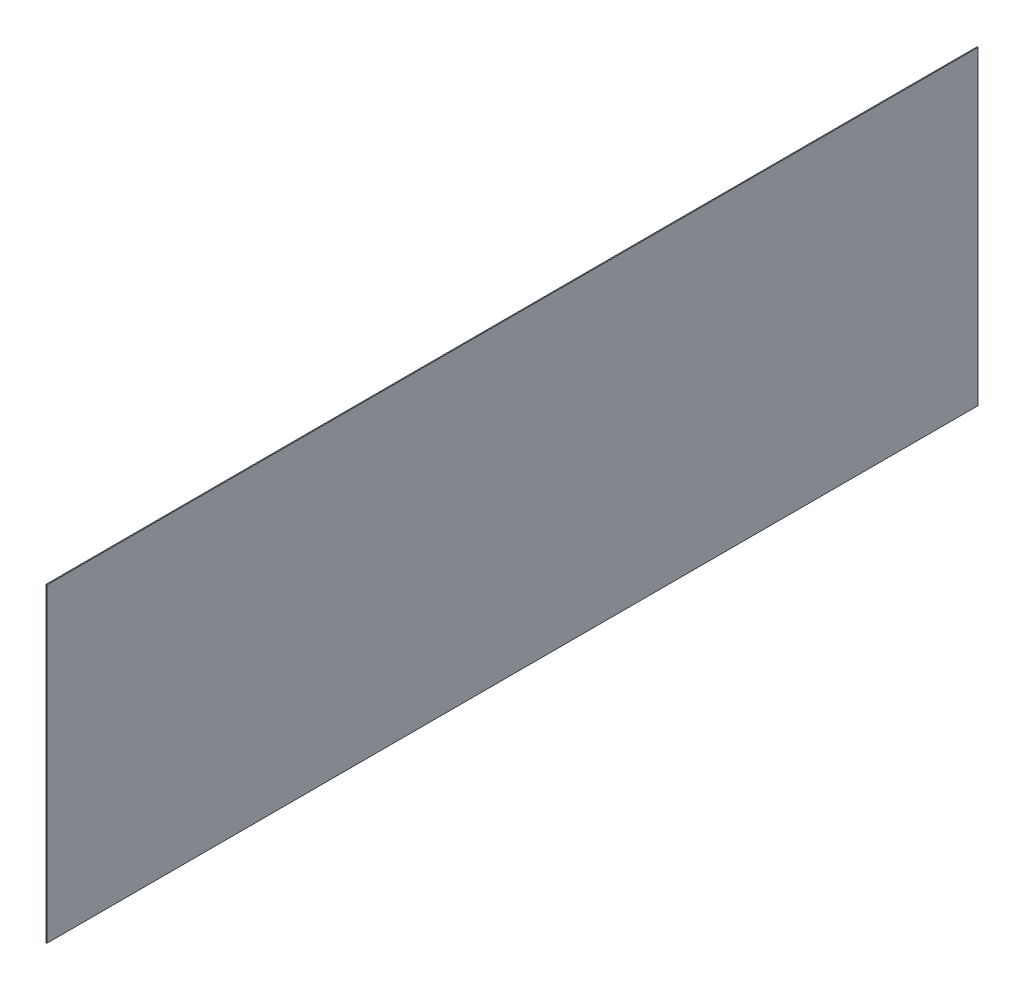
ISO-10303-21;
HEADER;
FILE_DESCRIPTION(('STEP AP214'),'2;1');
FILE_NAME('part.step','',(''),(''),'','','');
FILE_SCHEMA(('AUTOMOTIVE_DESIGN { 1 0 10303 214 1 1 1 1 }'));
ENDSEC;
DATA;
#1=APPLICATION_CONTEXT('core data for automotive mechanical design processes');
#2=APPLICATION_PROTOCOL_DEFINITION('international standard','automotive_design',2000,#1);
#3=PRODUCT_CONTEXT('',#1,'mechanical');
#4=PRODUCT('Part','Part','',(#3));
#5=PRODUCT_RELATED_PRODUCT_CATEGORY('part','',(#4));
#6=PRODUCT_DEFINITION_FORMATION('','',#4);
#7=PRODUCT_DEFINITION_CONTEXT('part definition',#1,'design');
#8=PRODUCT_DEFINITION('design','',#6,#7);
#9=PRODUCT_DEFINITION_SHAPE('','',#8);
#10=(LENGTH_UNIT() NAMED_UNIT(*) SI_UNIT(.MILLI.,.METRE.));
#11=(NAMED_UNIT(*) PLANE_ANGLE_UNIT() SI_UNIT($,.RADIAN.));
#12=(NAMED_UNIT(*) SI_UNIT($,.STERADIAN.) SOLID_ANGLE_UNIT());
#13=UNCERTAINTY_MEASURE_WITH_UNIT(LENGTH_MEASURE(1.E-05),#10,'distance_accuracy_value','');
#14=(GEOMETRIC_REPRESENTATION_CONTEXT(3) GLOBAL_UNCERTAINTY_ASSIGNED_CONTEXT((#13)) GLOBAL_UNIT_ASSIGNED_CONTEXT((#10,
#11,#12)) REPRESENTATION_CONTEXT('',''));
#15=CARTESIAN_POINT('',(0.,0.,0.));
#16=DIRECTION('',(0.,0.,1.));
#17=DIRECTION('',(1.,0.,0.));
#18=AXIS2_PLACEMENT_3D('',#15,#16,#17);
#19=CARTESIAN_POINT('',(0.,-320.,960.));
#20=DIRECTION('',(0.,0.,-1.));
#21=DIRECTION('',(0.,-1.,0.));
#22=AXIS2_PLACEMENT_3D('',#19,#20,#21);
#23=PLANE('',#22);
#24=DIRECTION('',(1.,0.,0.));
#25=VECTOR('',#24,1.);
#26=CARTESIAN_POINT('',(0.,320.,960.));
#27=LINE('',#26,#25);
#28=CARTESIAN_POINT('',(0.,320.,960.));
#29=VERTEX_POINT('',#28);
#30=CARTESIAN_POINT('',(2.,320.,960.));
#31=VERTEX_POINT('',#30);
#32=EDGE_CURVE('E11',#29,#31,#27,.T.);
#33=ORIENTED_EDGE('',*,*,#32,.F.);
#34=DIRECTION('',(0.,-1.,0.));
#35=VECTOR('',#34,1.);
#36=CARTESIAN_POINT('',(0.,-320.,960.));
#37=LINE('',#36,#35);
#38=CARTESIAN_POINT('',(0.,-320.,960.));
#39=VERTEX_POINT('',#38);
#40=EDGE_CURVE('E106',#29,#39,#37,.T.);
#41=ORIENTED_EDGE('',*,*,#40,.T.);
#42=DIRECTION('',(1.,0.,0.));
#43=VECTOR('',#42,1.);
#44=CARTESIAN_POINT('',(0.,-320.,960.));
#45=LINE('',#44,#43);
#46=CARTESIAN_POINT('',(2.,-320.,960.));
#47=VERTEX_POINT('',#46);
#48=EDGE_CURVE('E58',#39,#47,#45,.T.);
#49=ORIENTED_EDGE('',*,*,#48,.T.);
#50=DIRECTION('',(0.,1.,0.));
#51=VECTOR('',#50,1.);
#52=CARTESIAN_POINT('',(2.,0.,960.));
#53=LINE('',#52,#51);
#54=EDGE_CURVE('E119',#31,#47,#53,.F.);
#55=ORIENTED_EDGE('',*,*,#54,.F.);
#56=EDGE_LOOP('',(#33,#41,#49,#55));
#57=FACE_BOUND('',#56,.T.);
#58=ADVANCED_FACE('F47',(#57),#23,.F.);
#59=CARTESIAN_POINT('',(0.,-320.,960.));
#60=DIRECTION('',(0.,1.,0.));
#61=DIRECTION('',(0.,0.,-1.));
#62=AXIS2_PLACEMENT_3D('',#59,#60,#61);
#63=PLANE('',#62);
#64=ORIENTED_EDGE('',*,*,#48,.F.);
#65=DIRECTION('',(0.,0.,-1.));
#66=VECTOR('',#65,1.);
#67=CARTESIAN_POINT('',(0.,-320.,960.));
#68=LINE('',#67,#66);
#69=CARTESIAN_POINT('',(0.,-320.,-960.));
#70=VERTEX_POINT('',#69);
#71=EDGE_CURVE('E99',#39,#70,#68,.T.);
#72=ORIENTED_EDGE('',*,*,#71,.T.);
#73=DIRECTION('',(1.,0.,0.));
#74=VECTOR('',#73,1.);
#75=CARTESIAN_POINT('',(0.,-320.,-960.));
#76=LINE('',#75,#74);
#77=CARTESIAN_POINT('',(2.,-320.,-960.));
#78=VERTEX_POINT('',#77);
#79=EDGE_CURVE('E66',#70,#78,#76,.T.);
#80=ORIENTED_EDGE('',*,*,#79,.T.);
#81=DIRECTION('',(0.,0.,1.));
#82=VECTOR('',#81,1.);
#83=CARTESIAN_POINT('',(2.,-320.,0.));
#84=LINE('',#83,#82);
#85=EDGE_CURVE('E123',#47,#78,#84,.F.);
#86=ORIENTED_EDGE('',*,*,#85,.F.);
#87=EDGE_LOOP('',(#64,#72,#80,#86));
#88=FACE_BOUND('',#87,.T.);
#89=ADVANCED_FACE('F104',(#88),#63,.F.);
#90=CARTESIAN_POINT('',(0.,-320.,-960.));
#91=DIRECTION('',(0.,0.,1.));
#92=DIRECTION('',(0.,1.,0.));
#93=AXIS2_PLACEMENT_3D('',#90,#91,#92);
#94=PLANE('',#93);
#95=ORIENTED_EDGE('',*,*,#79,.F.);
#96=DIRECTION('',(0.,1.,0.));
#97=VECTOR('',#96,1.);
#98=CARTESIAN_POINT('',(0.,-320.,-960.));
#99=LINE('',#98,#97);
#100=CARTESIAN_POINT('',(0.,320.,-960.));
#101=VERTEX_POINT('',#100);
#102=EDGE_CURVE('E88',#70,#101,#99,.T.);
#103=ORIENTED_EDGE('',*,*,#102,.T.);
#104=DIRECTION('',(1.,0.,0.));
#105=VECTOR('',#104,1.);
#106=CARTESIAN_POINT('',(0.,320.,-960.));
#107=LINE('',#106,#105);
#108=CARTESIAN_POINT('',(2.,320.,-960.));
#109=VERTEX_POINT('',#108);
#110=EDGE_CURVE('E51',#101,#109,#107,.T.);
#111=ORIENTED_EDGE('',*,*,#110,.T.);
#112=DIRECTION('',(0.,1.,0.));
#113=VECTOR('',#112,1.);
#114=CARTESIAN_POINT('',(2.,0.,-960.));
#115=LINE('',#114,#113);
#116=EDGE_CURVE('E90',#78,#109,#115,.T.);
#117=ORIENTED_EDGE('',*,*,#116,.F.);
#118=EDGE_LOOP('',(#95,#103,#111,#117));
#119=FACE_BOUND('',#118,.T.);
#120=ADVANCED_FACE('F87',(#119),#94,.F.);
#121=CARTESIAN_POINT('',(0.,320.,960.));
#122=DIRECTION('',(0.,-1.,0.));
#123=DIRECTION('',(0.,0.,1.));
#124=AXIS2_PLACEMENT_3D('',#121,#122,#123);
#125=PLANE('',#124);
#126=DIRECTION('',(0.,0.,1.));
#127=VECTOR('',#126,1.);
#128=CARTESIAN_POINT('',(0.,320.,960.));
#129=LINE('',#128,#127);
#130=EDGE_CURVE('E101',#101,#29,#129,.T.);
#131=ORIENTED_EDGE('',*,*,#130,.T.);
#132=ORIENTED_EDGE('',*,*,#32,.T.);
#133=DIRECTION('',(0.,0.,1.));
#134=VECTOR('',#133,1.);
#135=CARTESIAN_POINT('',(2.,320.,0.));
#136=LINE('',#135,#134);
#137=EDGE_CURVE('E110',#109,#31,#136,.T.);
#138=ORIENTED_EDGE('',*,*,#137,.F.);
#139=ORIENTED_EDGE('',*,*,#110,.F.);
#140=EDGE_LOOP('',(#131,#132,#138,#139));
#141=FACE_BOUND('',#140,.T.);
#142=ADVANCED_FACE('F49',(#141),#125,.F.);
#143=CARTESIAN_POINT('',(2.,0.,0.));
#144=DIRECTION('',(-1.,0.,0.));
#145=DIRECTION('',(0.,0.,1.));
#146=AXIS2_PLACEMENT_3D('',#143,#144,#145);
#147=PLANE('',#146);
#148=ORIENTED_EDGE('',*,*,#116,.T.);
#149=ORIENTED_EDGE('',*,*,#137,.T.);
#150=ORIENTED_EDGE('',*,*,#54,.T.);
#151=ORIENTED_EDGE('',*,*,#85,.T.);
#152=EDGE_LOOP('',(#148,#149,#150,#151));
#153=FACE_BOUND('',#152,.T.);
#154=ADVANCED_FACE('F122',(#153),#147,.F.);
#155=CARTESIAN_POINT('',(0.,0.,0.));
#156=DIRECTION('',(-1.,0.,0.));
#157=DIRECTION('',(0.,0.,1.));
#158=AXIS2_PLACEMENT_3D('',#155,#156,#157);
#159=PLANE('',#158);
#160=ORIENTED_EDGE('',*,*,#102,.F.);
#161=ORIENTED_EDGE('',*,*,#71,.F.);
#162=ORIENTED_EDGE('',*,*,#40,.F.);
#163=ORIENTED_EDGE('',*,*,#130,.F.);
#164=EDGE_LOOP('',(#160,#161,#162,#163));
#165=FACE_BOUND('',#164,.T.);
#166=ADVANCED_FACE('F97',(#165),#159,.T.);
#167=CLOSED_SHELL('',(#58,#89,#120,#142,#154,#166));
#168=MANIFOLD_SOLID_BREP('B2',#167);
#169=ADVANCED_BREP_SHAPE_REPRESENTATION('',(#18,#168),#14);
#170=SHAPE_DEFINITION_REPRESENTATION(#9,#169);
ENDSEC;
END-ISO-10303-21;
